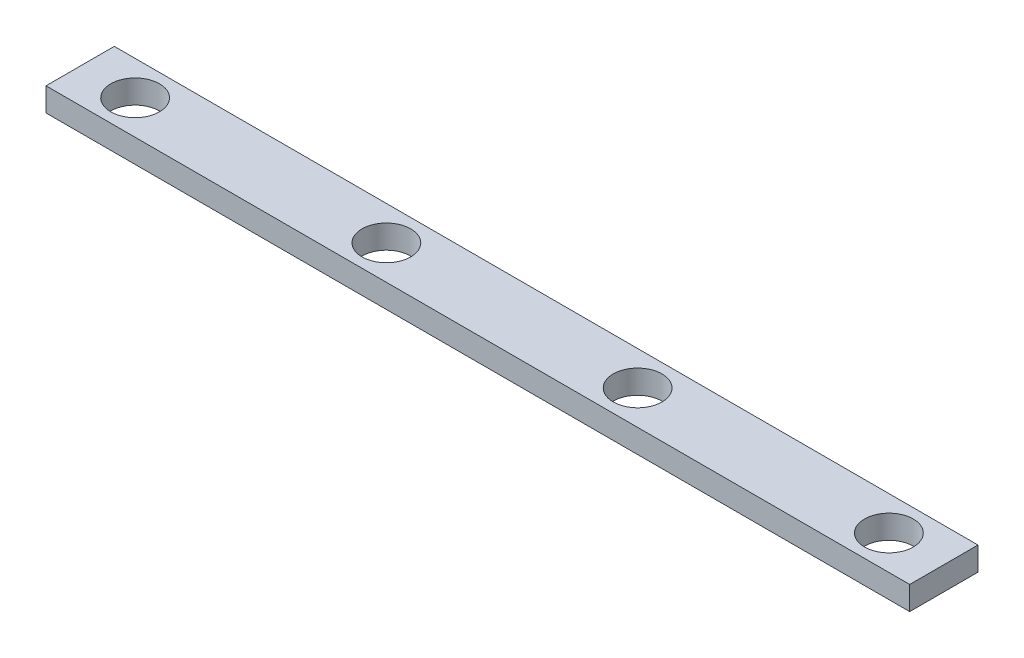
ISO-10303-21;
HEADER;
FILE_DESCRIPTION(('STEP AP214'),'2;1');
FILE_NAME('part.step','',(''),(''),'','','');
FILE_SCHEMA(('AUTOMOTIVE_DESIGN { 1 0 10303 214 1 1 1 1 }'));
ENDSEC;
DATA;
#1=APPLICATION_CONTEXT('core data for automotive mechanical design processes');
#2=APPLICATION_PROTOCOL_DEFINITION('international standard','automotive_design',2000,#1);
#3=PRODUCT_CONTEXT('',#1,'mechanical');
#4=PRODUCT('Part','Part','',(#3));
#5=PRODUCT_RELATED_PRODUCT_CATEGORY('part','',(#4));
#6=PRODUCT_DEFINITION_FORMATION('','',#4);
#7=PRODUCT_DEFINITION_CONTEXT('part definition',#1,'design');
#8=PRODUCT_DEFINITION('design','',#6,#7);
#9=PRODUCT_DEFINITION_SHAPE('','',#8);
#10=(LENGTH_UNIT() NAMED_UNIT(*) SI_UNIT(.MILLI.,.METRE.));
#11=(NAMED_UNIT(*) PLANE_ANGLE_UNIT() SI_UNIT($,.RADIAN.));
#12=(NAMED_UNIT(*) SI_UNIT($,.STERADIAN.) SOLID_ANGLE_UNIT());
#13=UNCERTAINTY_MEASURE_WITH_UNIT(LENGTH_MEASURE(1.E-05),#10,'distance_accuracy_value','');
#14=(GEOMETRIC_REPRESENTATION_CONTEXT(3) GLOBAL_UNCERTAINTY_ASSIGNED_CONTEXT((#13)) GLOBAL_UNIT_ASSIGNED_CONTEXT((#10,
#11,#12)) REPRESENTATION_CONTEXT('',''));
#15=CARTESIAN_POINT('',(0.,0.,0.));
#16=DIRECTION('',(0.,0.,1.));
#17=DIRECTION('',(1.,0.,0.));
#18=AXIS2_PLACEMENT_3D('',#15,#16,#17);
#19=CARTESIAN_POINT('',(0.,3.,0.));
#20=DIRECTION('',(0.,-1.,0.));
#21=DIRECTION('',(0.,0.,-1.));
#22=AXIS2_PLACEMENT_3D('',#19,#20,#21);
#23=PLANE('',#22);
#24=DIRECTION('',(0.,0.,-1.));
#25=VECTOR('',#24,1.);
#26=CARTESIAN_POINT('',(55.,3.,4.35));
#27=LINE('',#26,#25);
#28=CARTESIAN_POINT('',(55.,3.,4.35));
#29=VERTEX_POINT('',#28);
#30=CARTESIAN_POINT('',(55.,3.,-4.35));
#31=VERTEX_POINT('',#30);
#32=EDGE_CURVE('E93',#29,#31,#27,.T.);
#33=ORIENTED_EDGE('',*,*,#32,.T.);
#34=DIRECTION('',(-1.,0.,0.));
#35=VECTOR('',#34,1.);
#36=CARTESIAN_POINT('',(-55.,3.,-4.35));
#37=LINE('',#36,#35);
#38=CARTESIAN_POINT('',(-55.,3.,-4.35));
#39=VERTEX_POINT('',#38);
#40=EDGE_CURVE('E88',#31,#39,#37,.T.);
#41=ORIENTED_EDGE('',*,*,#40,.T.);
#42=DIRECTION('',(0.,0.,1.));
#43=VECTOR('',#42,1.);
#44=CARTESIAN_POINT('',(-55.,3.,4.35));
#45=LINE('',#44,#43);
#46=CARTESIAN_POINT('',(-55.,3.,4.35));
#47=VERTEX_POINT('',#46);
#48=EDGE_CURVE('E91',#39,#47,#45,.T.);
#49=ORIENTED_EDGE('',*,*,#48,.T.);
#50=DIRECTION('',(1.,0.,0.));
#51=VECTOR('',#50,1.);
#52=CARTESIAN_POINT('',(-55.,3.,4.35));
#53=LINE('',#52,#51);
#54=EDGE_CURVE('E58',#47,#29,#53,.T.);
#55=ORIENTED_EDGE('',*,*,#54,.T.);
#56=EDGE_LOOP('',(#33,#41,#49,#55));
#57=FACE_BOUND('',#56,.T.);
#58=CARTESIAN_POINT('',(48.,3.,0.));
#59=DIRECTION('',(0.,1.,0.));
#60=DIRECTION('',(0.,0.,1.));
#61=AXIS2_PLACEMENT_3D('',#58,#59,#60);
#62=CIRCLE('',#61,3.1);
#63=CARTESIAN_POINT('',(48.,3.,3.1));
#64=VERTEX_POINT('',#63);
#65=EDGE_CURVE('E108',#64,#64,#62,.T.);
#66=ORIENTED_EDGE('',*,*,#65,.F.);
#67=EDGE_LOOP('',(#66));
#68=FACE_BOUND('',#67,.T.);
#69=CARTESIAN_POINT('',(16.,3.,0.));
#70=DIRECTION('',(0.,1.,0.));
#71=DIRECTION('',(0.,0.,1.));
#72=AXIS2_PLACEMENT_3D('',#69,#70,#71);
#73=CIRCLE('',#72,3.1);
#74=CARTESIAN_POINT('',(16.,3.,3.1));
#75=VERTEX_POINT('',#74);
#76=EDGE_CURVE('E123',#75,#75,#73,.T.);
#77=ORIENTED_EDGE('',*,*,#76,.F.);
#78=EDGE_LOOP('',(#77));
#79=FACE_BOUND('',#78,.T.);
#80=CARTESIAN_POINT('',(-16.,3.,0.));
#81=DIRECTION('',(0.,1.,0.));
#82=DIRECTION('',(0.,0.,1.));
#83=AXIS2_PLACEMENT_3D('',#80,#81,#82);
#84=CIRCLE('',#83,3.1);
#85=CARTESIAN_POINT('',(-16.,3.,3.1));
#86=VERTEX_POINT('',#85);
#87=EDGE_CURVE('E129',#86,#86,#84,.T.);
#88=ORIENTED_EDGE('',*,*,#87,.F.);
#89=EDGE_LOOP('',(#88));
#90=FACE_BOUND('',#89,.T.);
#91=CARTESIAN_POINT('',(-48.,3.,0.));
#92=DIRECTION('',(0.,1.,0.));
#93=DIRECTION('',(0.,0.,1.));
#94=AXIS2_PLACEMENT_3D('',#91,#92,#93);
#95=CIRCLE('',#94,3.09999999999999);
#96=CARTESIAN_POINT('',(-48.,3.,3.09999999999999));
#97=VERTEX_POINT('',#96);
#98=EDGE_CURVE('E135',#97,#97,#95,.T.);
#99=ORIENTED_EDGE('',*,*,#98,.F.);
#100=EDGE_LOOP('',(#99));
#101=FACE_BOUND('',#100,.T.);
#102=ADVANCED_FACE('F41',(#57,#68,#79,#90,#101),#23,.F.);
#103=CARTESIAN_POINT('',(0.,0.,0.));
#104=DIRECTION('',(0.,-1.,0.));
#105=DIRECTION('',(0.,0.,-1.));
#106=AXIS2_PLACEMENT_3D('',#103,#104,#105);
#107=PLANE('',#106);
#108=CARTESIAN_POINT('',(-16.,0.,0.));
#109=DIRECTION('',(0.,1.,0.));
#110=DIRECTION('',(0.,0.,1.));
#111=AXIS2_PLACEMENT_3D('',#108,#109,#110);
#112=CIRCLE('',#111,3.1);
#113=CARTESIAN_POINT('',(-16.,0.,3.1));
#114=VERTEX_POINT('',#113);
#115=EDGE_CURVE('E132',#114,#114,#112,.T.);
#116=ORIENTED_EDGE('',*,*,#115,.T.);
#117=EDGE_LOOP('',(#116));
#118=FACE_BOUND('',#117,.T.);
#119=CARTESIAN_POINT('',(48.,0.,0.));
#120=DIRECTION('',(0.,1.,0.));
#121=DIRECTION('',(0.,0.,1.));
#122=AXIS2_PLACEMENT_3D('',#119,#120,#121);
#123=CIRCLE('',#122,3.1);
#124=CARTESIAN_POINT('',(48.,0.,3.1));
#125=VERTEX_POINT('',#124);
#126=EDGE_CURVE('E120',#125,#125,#123,.T.);
#127=ORIENTED_EDGE('',*,*,#126,.T.);
#128=EDGE_LOOP('',(#127));
#129=FACE_BOUND('',#128,.T.);
#130=DIRECTION('',(0.,0.,-1.));
#131=VECTOR('',#130,1.);
#132=CARTESIAN_POINT('',(55.,0.,4.35));
#133=LINE('',#132,#131);
#134=CARTESIAN_POINT('',(55.,0.,4.35));
#135=VERTEX_POINT('',#134);
#136=CARTESIAN_POINT('',(55.,0.,-4.35));
#137=VERTEX_POINT('',#136);
#138=EDGE_CURVE('E105',#135,#137,#133,.T.);
#139=ORIENTED_EDGE('',*,*,#138,.F.);
#140=DIRECTION('',(1.,0.,0.));
#141=VECTOR('',#140,1.);
#142=CARTESIAN_POINT('',(-55.,0.,4.35));
#143=LINE('',#142,#141);
#144=CARTESIAN_POINT('',(-55.,0.,4.35));
#145=VERTEX_POINT('',#144);
#146=EDGE_CURVE('E81',#145,#135,#143,.T.);
#147=ORIENTED_EDGE('',*,*,#146,.F.);
#148=DIRECTION('',(0.,0.,1.));
#149=VECTOR('',#148,1.);
#150=CARTESIAN_POINT('',(-55.,0.,4.35));
#151=LINE('',#150,#149);
#152=CARTESIAN_POINT('',(-55.,0.,-4.35));
#153=VERTEX_POINT('',#152);
#154=EDGE_CURVE('E75',#153,#145,#151,.T.);
#155=ORIENTED_EDGE('',*,*,#154,.F.);
#156=DIRECTION('',(-1.,0.,0.));
#157=VECTOR('',#156,1.);
#158=CARTESIAN_POINT('',(-55.,0.,-4.35));
#159=LINE('',#158,#157);
#160=EDGE_CURVE('E97',#137,#153,#159,.T.);
#161=ORIENTED_EDGE('',*,*,#160,.F.);
#162=EDGE_LOOP('',(#139,#147,#155,#161));
#163=FACE_BOUND('',#162,.T.);
#164=CARTESIAN_POINT('',(16.,0.,0.));
#165=DIRECTION('',(0.,1.,0.));
#166=DIRECTION('',(0.,0.,1.));
#167=AXIS2_PLACEMENT_3D('',#164,#165,#166);
#168=CIRCLE('',#167,3.1);
#169=CARTESIAN_POINT('',(16.,0.,3.1));
#170=VERTEX_POINT('',#169);
#171=EDGE_CURVE('E126',#170,#170,#168,.T.);
#172=ORIENTED_EDGE('',*,*,#171,.T.);
#173=EDGE_LOOP('',(#172));
#174=FACE_BOUND('',#173,.T.);
#175=CARTESIAN_POINT('',(-48.,0.,0.));
#176=DIRECTION('',(0.,1.,0.));
#177=DIRECTION('',(0.,0.,1.));
#178=AXIS2_PLACEMENT_3D('',#175,#176,#177);
#179=CIRCLE('',#178,3.09999999999999);
#180=CARTESIAN_POINT('',(-48.,0.,3.09999999999999));
#181=VERTEX_POINT('',#180);
#182=EDGE_CURVE('E138',#181,#181,#179,.T.);
#183=ORIENTED_EDGE('',*,*,#182,.T.);
#184=EDGE_LOOP('',(#183));
#185=FACE_BOUND('',#184,.T.);
#186=ADVANCED_FACE('F116',(#118,#129,#163,#174,#185),#107,.T.);
#187=CARTESIAN_POINT('',(55.,3.,4.35));
#188=DIRECTION('',(-1.,0.,0.));
#189=DIRECTION('',(0.,0.,1.));
#190=AXIS2_PLACEMENT_3D('',#187,#188,#189);
#191=PLANE('',#190);
#192=ORIENTED_EDGE('',*,*,#138,.T.);
#193=DIRECTION('',(0.,-1.,0.));
#194=VECTOR('',#193,1.);
#195=CARTESIAN_POINT('',(55.,3.,-4.35));
#196=LINE('',#195,#194);
#197=EDGE_CURVE('E11',#31,#137,#196,.T.);
#198=ORIENTED_EDGE('',*,*,#197,.F.);
#199=ORIENTED_EDGE('',*,*,#32,.F.);
#200=DIRECTION('',(0.,-1.,0.));
#201=VECTOR('',#200,1.);
#202=CARTESIAN_POINT('',(55.,3.,4.35));
#203=LINE('',#202,#201);
#204=EDGE_CURVE('E101',#29,#135,#203,.T.);
#205=ORIENTED_EDGE('',*,*,#204,.T.);
#206=EDGE_LOOP('',(#192,#198,#199,#205));
#207=FACE_BOUND('',#206,.T.);
#208=ADVANCED_FACE('F43',(#207),#191,.F.);
#209=CARTESIAN_POINT('',(-55.,3.,-4.35));
#210=DIRECTION('',(0.,0.,1.));
#211=DIRECTION('',(1.,0.,0.));
#212=AXIS2_PLACEMENT_3D('',#209,#210,#211);
#213=PLANE('',#212);
#214=ORIENTED_EDGE('',*,*,#160,.T.);
#215=DIRECTION('',(0.,-1.,0.));
#216=VECTOR('',#215,1.);
#217=CARTESIAN_POINT('',(-55.,3.,-4.35));
#218=LINE('',#217,#216);
#219=EDGE_CURVE('E50',#39,#153,#218,.T.);
#220=ORIENTED_EDGE('',*,*,#219,.F.);
#221=ORIENTED_EDGE('',*,*,#40,.F.);
#222=ORIENTED_EDGE('',*,*,#197,.T.);
#223=EDGE_LOOP('',(#214,#220,#221,#222));
#224=FACE_BOUND('',#223,.T.);
#225=ADVANCED_FACE('F96',(#224),#213,.F.);
#226=CARTESIAN_POINT('',(-55.,3.,4.35));
#227=DIRECTION('',(1.,0.,0.));
#228=DIRECTION('',(0.,0.,-1.));
#229=AXIS2_PLACEMENT_3D('',#226,#227,#228);
#230=PLANE('',#229);
#231=ORIENTED_EDGE('',*,*,#154,.T.);
#232=DIRECTION('',(0.,-1.,0.));
#233=VECTOR('',#232,1.);
#234=CARTESIAN_POINT('',(-55.,3.,4.35));
#235=LINE('',#234,#233);
#236=EDGE_CURVE('E98',#47,#145,#235,.T.);
#237=ORIENTED_EDGE('',*,*,#236,.F.);
#238=ORIENTED_EDGE('',*,*,#48,.F.);
#239=ORIENTED_EDGE('',*,*,#219,.T.);
#240=EDGE_LOOP('',(#231,#237,#238,#239));
#241=FACE_BOUND('',#240,.T.);
#242=ADVANCED_FACE('F99',(#241),#230,.F.);
#243=CARTESIAN_POINT('',(-55.,3.,4.35));
#244=DIRECTION('',(0.,0.,-1.));
#245=DIRECTION('',(-1.,0.,0.));
#246=AXIS2_PLACEMENT_3D('',#243,#244,#245);
#247=PLANE('',#246);
#248=ORIENTED_EDGE('',*,*,#146,.T.);
#249=ORIENTED_EDGE('',*,*,#204,.F.);
#250=ORIENTED_EDGE('',*,*,#54,.F.);
#251=ORIENTED_EDGE('',*,*,#236,.T.);
#252=EDGE_LOOP('',(#248,#249,#250,#251));
#253=FACE_BOUND('',#252,.T.);
#254=ADVANCED_FACE('F113',(#253),#247,.F.);
#255=CARTESIAN_POINT('',(48.,3.,0.));
#256=DIRECTION('',(0.,-1.,0.));
#257=DIRECTION('',(0.,0.,-1.));
#258=AXIS2_PLACEMENT_3D('',#255,#256,#257);
#259=CYLINDRICAL_SURFACE('',#258,3.1);
#260=ORIENTED_EDGE('',*,*,#65,.T.);
#261=EDGE_LOOP('',(#260));
#262=FACE_BOUND('',#261,.T.);
#263=ORIENTED_EDGE('',*,*,#126,.F.);
#264=EDGE_LOOP('',(#263));
#265=FACE_BOUND('',#264,.T.);
#266=ADVANCED_FACE('F155',(#262,#265),#259,.F.);
#267=CARTESIAN_POINT('',(16.,3.,0.));
#268=DIRECTION('',(0.,-1.,0.));
#269=DIRECTION('',(0.,0.,-1.));
#270=AXIS2_PLACEMENT_3D('',#267,#268,#269);
#271=CYLINDRICAL_SURFACE('',#270,3.1);
#272=ORIENTED_EDGE('',*,*,#76,.T.);
#273=EDGE_LOOP('',(#272));
#274=FACE_BOUND('',#273,.T.);
#275=ORIENTED_EDGE('',*,*,#171,.F.);
#276=EDGE_LOOP('',(#275));
#277=FACE_BOUND('',#276,.T.);
#278=ADVANCED_FACE('F209',(#274,#277),#271,.F.);
#279=CARTESIAN_POINT('',(-16.,3.,0.));
#280=DIRECTION('',(0.,-1.,0.));
#281=DIRECTION('',(0.,0.,-1.));
#282=AXIS2_PLACEMENT_3D('',#279,#280,#281);
#283=CYLINDRICAL_SURFACE('',#282,3.1);
#284=ORIENTED_EDGE('',*,*,#87,.T.);
#285=EDGE_LOOP('',(#284));
#286=FACE_BOUND('',#285,.T.);
#287=ORIENTED_EDGE('',*,*,#115,.F.);
#288=EDGE_LOOP('',(#287));
#289=FACE_BOUND('',#288,.T.);
#290=ADVANCED_FACE('F218',(#286,#289),#283,.F.);
#291=CARTESIAN_POINT('',(-48.,3.,0.));
#292=DIRECTION('',(0.,-1.,0.));
#293=DIRECTION('',(0.,0.,-1.));
#294=AXIS2_PLACEMENT_3D('',#291,#292,#293);
#295=CYLINDRICAL_SURFACE('',#294,3.09999999999999);
#296=ORIENTED_EDGE('',*,*,#98,.T.);
#297=EDGE_LOOP('',(#296));
#298=FACE_BOUND('',#297,.T.);
#299=ORIENTED_EDGE('',*,*,#182,.F.);
#300=EDGE_LOOP('',(#299));
#301=FACE_BOUND('',#300,.T.);
#302=ADVANCED_FACE('F144',(#298,#301),#295,.F.);
#303=CLOSED_SHELL('',(#102,#186,#208,#225,#242,#254,#266,#278,#290,#302));
#304=MANIFOLD_SOLID_BREP('B2',#303);
#305=ADVANCED_BREP_SHAPE_REPRESENTATION('',(#18,#304),#14);
#306=SHAPE_DEFINITION_REPRESENTATION(#9,#305);
ENDSEC;
END-ISO-10303-21;
